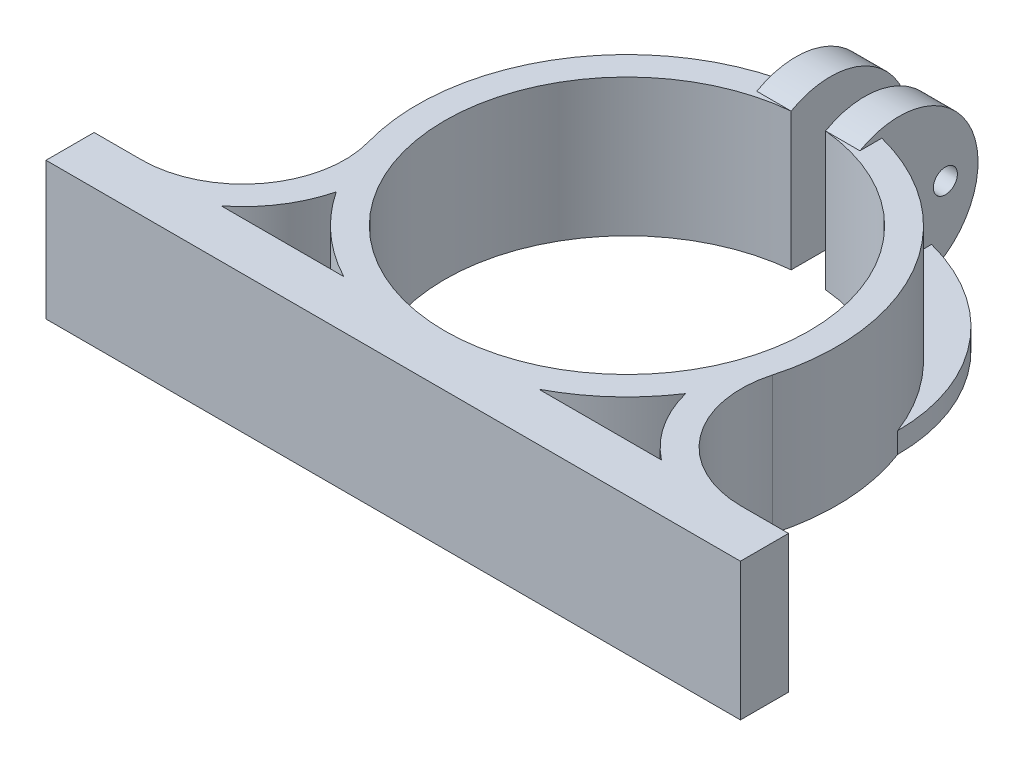
ISO-10303-21;
HEADER;
FILE_DESCRIPTION(('STEP AP214'),'2;1');
FILE_NAME('part.step','',(''),(''),'','','');
FILE_SCHEMA(('AUTOMOTIVE_DESIGN { 1 0 10303 214 1 1 1 1 }'));
ENDSEC;
DATA;
#1=APPLICATION_CONTEXT('core data for automotive mechanical design processes');
#2=APPLICATION_PROTOCOL_DEFINITION('international standard','automotive_design',2000,#1);
#3=PRODUCT_CONTEXT('',#1,'mechanical');
#4=PRODUCT('Part','Part','',(#3));
#5=PRODUCT_RELATED_PRODUCT_CATEGORY('part','',(#4));
#6=PRODUCT_DEFINITION_FORMATION('','',#4);
#7=PRODUCT_DEFINITION_CONTEXT('part definition',#1,'design');
#8=PRODUCT_DEFINITION('design','',#6,#7);
#9=PRODUCT_DEFINITION_SHAPE('','',#8);
#10=(LENGTH_UNIT() NAMED_UNIT(*) SI_UNIT(.MILLI.,.METRE.));
#11=(NAMED_UNIT(*) PLANE_ANGLE_UNIT() SI_UNIT($,.RADIAN.));
#12=(NAMED_UNIT(*) SI_UNIT($,.STERADIAN.) SOLID_ANGLE_UNIT());
#13=UNCERTAINTY_MEASURE_WITH_UNIT(LENGTH_MEASURE(1.E-05),#10,'distance_accuracy_value','');
#14=(GEOMETRIC_REPRESENTATION_CONTEXT(3) GLOBAL_UNCERTAINTY_ASSIGNED_CONTEXT((#13)) GLOBAL_UNIT_ASSIGNED_CONTEXT((#10,
#11,#12)) REPRESENTATION_CONTEXT('',''));
#15=CARTESIAN_POINT('',(0.,0.,0.));
#16=DIRECTION('',(0.,0.,1.));
#17=DIRECTION('',(1.,0.,0.));
#18=AXIS2_PLACEMENT_3D('',#15,#16,#17);
#19=CARTESIAN_POINT('',(0.,20.,-34.));
#20=DIRECTION('',(0.,-1.,0.));
#21=DIRECTION('',(0.,0.,-1.));
#22=AXIS2_PLACEMENT_3D('',#19,#20,#21);
#23=CYLINDRICAL_SURFACE('',#22,30.5);
#24=DIRECTION('',(0.,-1.,0.));
#25=VECTOR('',#24,1.);
#26=CARTESIAN_POINT('',(28.5,3.,-44.8627804912001));
#27=LINE('',#26,#25);
#28=CARTESIAN_POINT('',(28.5,3.,-44.8627804912001));
#29=VERTEX_POINT('',#28);
#30=CARTESIAN_POINT('',(28.5,0.,-44.8627804912001));
#31=VERTEX_POINT('',#30);
#32=EDGE_CURVE('E217',#29,#31,#27,.T.);
#33=ORIENTED_EDGE('',*,*,#32,.F.);
#34=CARTESIAN_POINT('',(0.,3.,-34.));
#35=DIRECTION('',(0.,-1.,0.));
#36=DIRECTION('',(0.,0.,1.));
#37=AXIS2_PLACEMENT_3D('',#34,#35,#36);
#38=CIRCLE('',#37,30.5);
#39=CARTESIAN_POINT('',(7.5,3.,-63.563490998189));
#40=VERTEX_POINT('',#39);
#41=EDGE_CURVE('E204',#40,#29,#38,.T.);
#42=ORIENTED_EDGE('',*,*,#41,.F.);
#43=DIRECTION('',(0.,-1.,0.));
#44=VECTOR('',#43,1.);
#45=CARTESIAN_POINT('',(7.5,20.,-63.563490998189));
#46=LINE('',#45,#44);
#47=CARTESIAN_POINT('',(7.5,20.,-63.563490998189));
#48=VERTEX_POINT('',#47);
#49=EDGE_CURVE('E41',#48,#40,#46,.T.);
#50=ORIENTED_EDGE('',*,*,#49,.F.);
#51=CARTESIAN_POINT('',(0.,20.,-34.));
#52=DIRECTION('',(0.,1.,0.));
#53=DIRECTION('',(0.,0.,1.));
#54=AXIS2_PLACEMENT_3D('',#51,#52,#53);
#55=CIRCLE('',#54,30.5);
#56=CARTESIAN_POINT('',(29.3683181588605,20.,-25.7688464648055));
#57=VERTEX_POINT('',#56);
#58=EDGE_CURVE('E414',#57,#48,#55,.T.);
#59=ORIENTED_EDGE('',*,*,#58,.F.);
#60=DIRECTION('',(0.,-1.,0.));
#61=VECTOR('',#60,1.);
#62=CARTESIAN_POINT('',(29.3683181588605,20.,-25.7688464648055));
#63=LINE('',#62,#61);
#64=CARTESIAN_POINT('',(29.3683181588605,0.,-25.7688464648055));
#65=VERTEX_POINT('',#64);
#66=EDGE_CURVE('E400',#57,#65,#63,.T.);
#67=ORIENTED_EDGE('',*,*,#66,.T.);
#68=CARTESIAN_POINT('',(0.,0.,-34.));
#69=DIRECTION('',(0.,1.,0.));
#70=DIRECTION('',(0.,0.,1.));
#71=AXIS2_PLACEMENT_3D('',#68,#69,#70);
#72=CIRCLE('',#71,30.5);
#73=EDGE_CURVE('E368',#65,#31,#72,.T.);
#74=ORIENTED_EDGE('',*,*,#73,.T.);
#75=EDGE_LOOP('',(#33,#42,#50,#59,#67,#74));
#76=FACE_BOUND('',#75,.T.);
#77=ADVANCED_FACE('F33',(#76),#23,.T.);
#78=CARTESIAN_POINT('',(7.5,10.,-66.0607202623461));
#79=DIRECTION('',(-1.,0.,0.));
#80=DIRECTION('',(0.,0.,1.));
#81=AXIS2_PLACEMENT_3D('',#78,#79,#80);
#82=PLANE('',#81);
#83=CARTESIAN_POINT('',(7.5,10.,-72.8107202623461));
#84=DIRECTION('',(-1.,0.,0.));
#85=DIRECTION('',(0.,0.,1.));
#86=AXIS2_PLACEMENT_3D('',#83,#84,#85);
#87=CIRCLE('',#86,1.75);
#88=CARTESIAN_POINT('',(7.5,10.,-71.0607202623461));
#89=VERTEX_POINT('',#88);
#90=EDGE_CURVE('E484',#89,#89,#87,.T.);
#91=ORIENTED_EDGE('',*,*,#90,.T.);
#92=EDGE_LOOP('',(#91));
#93=FACE_BOUND('',#92,.T.);
#94=DIRECTION('',(0.,-1.,0.));
#95=VECTOR('',#94,1.);
#96=CARTESIAN_POINT('',(7.5,3.,-70.7922943728291));
#97=LINE('',#96,#95);
#98=CARTESIAN_POINT('',(7.5,3.,-70.7922943728291));
#99=VERTEX_POINT('',#98);
#100=CARTESIAN_POINT('',(7.5,0.,-70.7922943728291));
#101=VERTEX_POINT('',#100);
#102=EDGE_CURVE('E210',#99,#101,#97,.T.);
#103=ORIENTED_EDGE('',*,*,#102,.T.);
#104=DIRECTION('',(0.,0.,1.));
#105=VECTOR('',#104,1.);
#106=CARTESIAN_POINT('',(7.5,0.,-60.3818119165458));
#107=LINE('',#106,#105);
#108=CARTESIAN_POINT('',(7.5,0.,-71.7396286081464));
#109=VERTEX_POINT('',#108);
#110=EDGE_CURVE('E493',#109,#101,#107,.T.);
#111=ORIENTED_EDGE('',*,*,#110,.F.);
#112=CARTESIAN_POINT('',(7.5,10.,-66.0607202623461));
#113=DIRECTION('',(-1.,0.,0.));
#114=DIRECTION('',(0.,0.,1.));
#115=AXIS2_PLACEMENT_3D('',#112,#113,#114);
#116=CIRCLE('',#115,11.5);
#117=CARTESIAN_POINT('',(7.5,20.,-60.3818119165458));
#118=VERTEX_POINT('',#117);
#119=EDGE_CURVE('E490',#118,#109,#116,.T.);
#120=ORIENTED_EDGE('',*,*,#119,.F.);
#121=DIRECTION('',(0.,0.,-1.));
#122=VECTOR('',#121,1.);
#123=CARTESIAN_POINT('',(7.5,20.,-21.7800869565217));
#124=LINE('',#123,#122);
#125=EDGE_CURVE('E501',#118,#48,#124,.T.);
#126=ORIENTED_EDGE('',*,*,#125,.T.);
#127=ORIENTED_EDGE('',*,*,#49,.T.);
#128=DIRECTION('',(0.,0.,1.));
#129=VECTOR('',#128,1.);
#130=CARTESIAN_POINT('',(7.5,3.,-70.7922943728291));
#131=LINE('',#130,#129);
#132=EDGE_CURVE('E202',#99,#40,#131,.T.);
#133=ORIENTED_EDGE('',*,*,#132,.F.);
#134=EDGE_LOOP('',(#103,#111,#120,#126,#127,#133));
#135=FACE_BOUND('',#134,.T.);
#136=ADVANCED_FACE('F220',(#93,#135),#82,.F.);
#137=CARTESIAN_POINT('',(0.,20.,-34.));
#138=DIRECTION('',(0.,-1.,0.));
#139=DIRECTION('',(0.,0.,-1.));
#140=AXIS2_PLACEMENT_3D('',#137,#138,#139);
#141=CYLINDRICAL_SURFACE('',#140,30.5);
#142=DIRECTION('',(0.,-1.,0.));
#143=VECTOR('',#142,1.);
#144=CARTESIAN_POINT('',(-28.5,3.,-44.8627804912001));
#145=LINE('',#144,#143);
#146=CARTESIAN_POINT('',(-28.5,3.,-44.8627804912001));
#147=VERTEX_POINT('',#146);
#148=CARTESIAN_POINT('',(-28.5,0.,-44.8627804912001));
#149=VERTEX_POINT('',#148);
#150=EDGE_CURVE('E52',#147,#149,#145,.T.);
#151=ORIENTED_EDGE('',*,*,#150,.T.);
#152=CARTESIAN_POINT('',(0.,0.,-34.));
#153=DIRECTION('',(0.,1.,0.));
#154=DIRECTION('',(0.,0.,1.));
#155=AXIS2_PLACEMENT_3D('',#152,#153,#154);
#156=CIRCLE('',#155,30.5);
#157=CARTESIAN_POINT('',(-29.3683181588605,0.,-25.7688464648056));
#158=VERTEX_POINT('',#157);
#159=EDGE_CURVE('E377',#149,#158,#156,.T.);
#160=ORIENTED_EDGE('',*,*,#159,.T.);
#161=DIRECTION('',(0.,-1.,0.));
#162=VECTOR('',#161,1.);
#163=CARTESIAN_POINT('',(-29.3683181588605,20.,-25.7688464648056));
#164=LINE('',#163,#162);
#165=CARTESIAN_POINT('',(-29.3683181588605,20.,-25.7688464648056));
#166=VERTEX_POINT('',#165);
#167=EDGE_CURVE('E391',#166,#158,#164,.T.);
#168=ORIENTED_EDGE('',*,*,#167,.F.);
#169=CARTESIAN_POINT('',(0.,20.,-34.));
#170=DIRECTION('',(0.,1.,0.));
#171=DIRECTION('',(0.,0.,1.));
#172=AXIS2_PLACEMENT_3D('',#169,#170,#171);
#173=CIRCLE('',#172,30.5);
#174=CARTESIAN_POINT('',(-7.5,20.,-63.563490998189));
#175=VERTEX_POINT('',#174);
#176=EDGE_CURVE('E425',#175,#166,#173,.T.);
#177=ORIENTED_EDGE('',*,*,#176,.F.);
#178=DIRECTION('',(0.,-1.,0.));
#179=VECTOR('',#178,1.);
#180=CARTESIAN_POINT('',(-7.5,20.,-63.563490998189));
#181=LINE('',#180,#179);
#182=CARTESIAN_POINT('',(-7.5,3.,-63.563490998189));
#183=VERTEX_POINT('',#182);
#184=EDGE_CURVE('E11',#175,#183,#181,.T.);
#185=ORIENTED_EDGE('',*,*,#184,.T.);
#186=CARTESIAN_POINT('',(0.,3.,-34.));
#187=DIRECTION('',(0.,-1.,0.));
#188=DIRECTION('',(0.,0.,1.));
#189=AXIS2_PLACEMENT_3D('',#186,#187,#188);
#190=CIRCLE('',#189,30.5);
#191=EDGE_CURVE('E47',#147,#183,#190,.T.);
#192=ORIENTED_EDGE('',*,*,#191,.F.);
#193=EDGE_LOOP('',(#151,#160,#168,#177,#185,#192));
#194=FACE_BOUND('',#193,.T.);
#195=ADVANCED_FACE('F249',(#194),#141,.T.);
#196=CARTESIAN_POINT('',(-7.5,10.,-66.0607202623461));
#197=DIRECTION('',(-1.,0.,0.));
#198=DIRECTION('',(0.,0.,1.));
#199=AXIS2_PLACEMENT_3D('',#196,#197,#198);
#200=PLANE('',#199);
#201=CARTESIAN_POINT('',(-7.5,10.,-72.8107202623461));
#202=DIRECTION('',(-1.,0.,0.));
#203=DIRECTION('',(0.,0.,1.));
#204=AXIS2_PLACEMENT_3D('',#201,#202,#203);
#205=CIRCLE('',#204,1.75);
#206=CARTESIAN_POINT('',(-7.5,10.,-71.0607202623461));
#207=VERTEX_POINT('',#206);
#208=EDGE_CURVE('E461',#207,#207,#205,.T.);
#209=ORIENTED_EDGE('',*,*,#208,.F.);
#210=EDGE_LOOP('',(#209));
#211=FACE_BOUND('',#210,.T.);
#212=DIRECTION('',(0.,0.,1.));
#213=VECTOR('',#212,1.);
#214=CARTESIAN_POINT('',(-7.5,0.,-60.3818119165458));
#215=LINE('',#214,#213);
#216=CARTESIAN_POINT('',(-7.5,0.,-71.7396286081464));
#217=VERTEX_POINT('',#216);
#218=CARTESIAN_POINT('',(-7.5,0.,-70.7922943728291));
#219=VERTEX_POINT('',#218);
#220=EDGE_CURVE('E472',#217,#219,#215,.T.);
#221=ORIENTED_EDGE('',*,*,#220,.T.);
#222=DIRECTION('',(0.,-1.,0.));
#223=VECTOR('',#222,1.);
#224=CARTESIAN_POINT('',(-7.5,3.,-70.7922943728291));
#225=LINE('',#224,#223);
#226=CARTESIAN_POINT('',(-7.5,3.,-70.7922943728291));
#227=VERTEX_POINT('',#226);
#228=EDGE_CURVE('E455',#227,#219,#225,.T.);
#229=ORIENTED_EDGE('',*,*,#228,.F.);
#230=DIRECTION('',(0.,0.,-1.));
#231=VECTOR('',#230,1.);
#232=CARTESIAN_POINT('',(-7.5,3.,-70.7922943728291));
#233=LINE('',#232,#231);
#234=EDGE_CURVE('E458',#183,#227,#233,.T.);
#235=ORIENTED_EDGE('',*,*,#234,.F.);
#236=ORIENTED_EDGE('',*,*,#184,.F.);
#237=DIRECTION('',(0.,0.,-1.));
#238=VECTOR('',#237,1.);
#239=CARTESIAN_POINT('',(-7.5,20.,-21.7800869565217));
#240=LINE('',#239,#238);
#241=CARTESIAN_POINT('',(-7.5,20.,-60.3818119165458));
#242=VERTEX_POINT('',#241);
#243=EDGE_CURVE('E479',#242,#175,#240,.T.);
#244=ORIENTED_EDGE('',*,*,#243,.F.);
#245=CARTESIAN_POINT('',(-7.5,10.,-66.0607202623461));
#246=DIRECTION('',(-1.,0.,0.));
#247=DIRECTION('',(0.,0.,1.));
#248=AXIS2_PLACEMENT_3D('',#245,#246,#247);
#249=CIRCLE('',#248,11.5);
#250=EDGE_CURVE('E465',#242,#217,#249,.T.);
#251=ORIENTED_EDGE('',*,*,#250,.T.);
#252=EDGE_LOOP('',(#221,#229,#235,#236,#244,#251));
#253=FACE_BOUND('',#252,.T.);
#254=ADVANCED_FACE('F245',(#211,#253),#200,.T.);
#255=CARTESIAN_POINT('',(-43.6,20.,-21.7800869565217));
#256=DIRECTION('',(0.,-1.,0.));
#257=DIRECTION('',(0.,0.,-1.));
#258=AXIS2_PLACEMENT_3D('',#255,#256,#257);
#259=PLANE('',#258);
#260=CARTESIAN_POINT('',(0.,20.,-34.));
#261=DIRECTION('',(0.,-1.,0.));
#262=DIRECTION('',(0.,0.,1.));
#263=AXIS2_PLACEMENT_3D('',#260,#261,#262);
#264=CIRCLE('',#263,30.5);
#265=CARTESIAN_POINT('',(-14.1862609591111,20.,-7.));
#266=VERTEX_POINT('',#265);
#267=CARTESIAN_POINT('',(-25.4061030572735,20.,-17.1245762292262));
#268=VERTEX_POINT('',#267);
#269=EDGE_CURVE('E530',#266,#268,#264,.T.);
#270=ORIENTED_EDGE('',*,*,#269,.F.);
#271=DIRECTION('',(1.,0.,0.));
#272=VECTOR('',#271,1.);
#273=CARTESIAN_POINT('',(-32.0137712929455,20.,-7.));
#274=LINE('',#273,#272);
#275=CARTESIAN_POINT('',(-32.0137712929455,20.,-7.));
#276=VERTEX_POINT('',#275);
#277=EDGE_CURVE('E536',#276,#266,#274,.T.);
#278=ORIENTED_EDGE('',*,*,#277,.F.);
#279=CARTESIAN_POINT('',(-43.6,20.,-21.7800869565217));
#280=DIRECTION('',(0.,-1.,0.));
#281=DIRECTION('',(0.,0.,-1.));
#282=AXIS2_PLACEMENT_3D('',#279,#280,#281);
#283=CIRCLE('',#282,18.7800869565217);
#284=EDGE_CURVE('E532',#268,#276,#283,.T.);
#285=ORIENTED_EDGE('',*,*,#284,.F.);
#286=EDGE_LOOP('',(#270,#278,#285));
#287=FACE_BOUND('',#286,.T.);
#288=CARTESIAN_POINT('',(0.,20.,-34.));
#289=DIRECTION('',(0.,-1.,0.));
#290=DIRECTION('',(0.,0.,1.));
#291=AXIS2_PLACEMENT_3D('',#288,#289,#290);
#292=CIRCLE('',#291,26.5);
#293=CARTESIAN_POINT('',(2.5,20.,-60.3818119165458));
#294=VERTEX_POINT('',#293);
#295=CARTESIAN_POINT('',(-2.5,20.,-60.3818119165458));
#296=VERTEX_POINT('',#295);
#297=EDGE_CURVE('E422',#294,#296,#292,.T.);
#298=ORIENTED_EDGE('',*,*,#297,.T.);
#299=DIRECTION('',(-1.,0.,0.));
#300=VECTOR('',#299,1.);
#301=CARTESIAN_POINT('',(-2.5,20.,-60.3818119165458));
#302=LINE('',#301,#300);
#303=EDGE_CURVE('E476',#296,#242,#302,.T.);
#304=ORIENTED_EDGE('',*,*,#303,.T.);
#305=ORIENTED_EDGE('',*,*,#243,.T.);
#306=ORIENTED_EDGE('',*,*,#176,.T.);
#307=CARTESIAN_POINT('',(-43.6,20.,-21.7800869565217));
#308=DIRECTION('',(0.,-1.,0.));
#309=DIRECTION('',(0.,0.,-1.));
#310=AXIS2_PLACEMENT_3D('',#307,#308,#309);
#311=CIRCLE('',#310,14.7800869565217);
#312=CARTESIAN_POINT('',(-43.6,20.,-7.));
#313=VERTEX_POINT('',#312);
#314=EDGE_CURVE('E427',#166,#313,#311,.T.);
#315=ORIENTED_EDGE('',*,*,#314,.T.);
#316=DIRECTION('',(-1.,0.,0.));
#317=VECTOR('',#316,1.);
#318=CARTESIAN_POINT('',(-50.5,20.,-7.));
#319=LINE('',#318,#317);
#320=CARTESIAN_POINT('',(-50.5,20.,-7.));
#321=VERTEX_POINT('',#320);
#322=EDGE_CURVE('E388',#313,#321,#319,.T.);
#323=ORIENTED_EDGE('',*,*,#322,.T.);
#324=DIRECTION('',(0.,0.,1.));
#325=VECTOR('',#324,1.);
#326=CARTESIAN_POINT('',(-50.5,20.,0.));
#327=LINE('',#326,#325);
#328=CARTESIAN_POINT('',(-50.5,20.,0.));
#329=VERTEX_POINT('',#328);
#330=EDGE_CURVE('E383',#321,#329,#327,.T.);
#331=ORIENTED_EDGE('',*,*,#330,.T.);
#332=DIRECTION('',(1.,0.,0.));
#333=VECTOR('',#332,1.);
#334=CARTESIAN_POINT('',(-50.5,20.,0.));
#335=LINE('',#334,#333);
#336=CARTESIAN_POINT('',(50.5,20.,0.));
#337=VERTEX_POINT('',#336);
#338=EDGE_CURVE('E416',#329,#337,#335,.T.);
#339=ORIENTED_EDGE('',*,*,#338,.T.);
#340=DIRECTION('',(0.,0.,-1.));
#341=VECTOR('',#340,1.);
#342=CARTESIAN_POINT('',(50.5,20.,0.));
#343=LINE('',#342,#341);
#344=CARTESIAN_POINT('',(50.5,20.,-7.));
#345=VERTEX_POINT('',#344);
#346=EDGE_CURVE('E355',#337,#345,#343,.T.);
#347=ORIENTED_EDGE('',*,*,#346,.T.);
#348=DIRECTION('',(-1.,0.,0.));
#349=VECTOR('',#348,1.);
#350=CARTESIAN_POINT('',(43.6,20.,-7.));
#351=LINE('',#350,#349);
#352=CARTESIAN_POINT('',(43.6,20.,-7.));
#353=VERTEX_POINT('',#352);
#354=EDGE_CURVE('E409',#345,#353,#351,.T.);
#355=ORIENTED_EDGE('',*,*,#354,.T.);
#356=CARTESIAN_POINT('',(43.6,20.,-21.7800869565217));
#357=DIRECTION('',(0.,-1.,0.));
#358=DIRECTION('',(0.,0.,1.));
#359=AXIS2_PLACEMENT_3D('',#356,#357,#358);
#360=CIRCLE('',#359,14.7800869565217);
#361=EDGE_CURVE('E412',#353,#57,#360,.T.);
#362=ORIENTED_EDGE('',*,*,#361,.T.);
#363=ORIENTED_EDGE('',*,*,#58,.T.);
#364=ORIENTED_EDGE('',*,*,#125,.F.);
#365=DIRECTION('',(-1.,0.,0.));
#366=VECTOR('',#365,1.);
#367=CARTESIAN_POINT('',(7.5,20.,-60.3818119165458));
#368=LINE('',#367,#366);
#369=EDGE_CURVE('E498',#118,#294,#368,.T.);
#370=ORIENTED_EDGE('',*,*,#369,.T.);
#371=EDGE_LOOP('',(#298,#304,#305,#306,#315,#323,#331,#339,#347,#355,#362,#363,#364,#370));
#372=FACE_BOUND('',#371,.T.);
#373=CARTESIAN_POINT('',(0.,20.,-34.));
#374=DIRECTION('',(0.,-1.,0.));
#375=DIRECTION('',(0.,0.,1.));
#376=AXIS2_PLACEMENT_3D('',#373,#374,#375);
#377=CIRCLE('',#376,30.5);
#378=CARTESIAN_POINT('',(25.4061030572735,20.,-17.1245762292262));
#379=VERTEX_POINT('',#378);
#380=CARTESIAN_POINT('',(14.1862609591111,20.,-7.));
#381=VERTEX_POINT('',#380);
#382=EDGE_CURVE('E506',#379,#381,#377,.T.);
#383=ORIENTED_EDGE('',*,*,#382,.F.);
#384=CARTESIAN_POINT('',(43.6,20.,-21.7800869565217));
#385=DIRECTION('',(0.,-1.,0.));
#386=DIRECTION('',(0.,0.,1.));
#387=AXIS2_PLACEMENT_3D('',#384,#385,#386);
#388=CIRCLE('',#387,18.7800869565217);
#389=CARTESIAN_POINT('',(32.0137712929455,20.,-7.));
#390=VERTEX_POINT('',#389);
#391=EDGE_CURVE('E512',#390,#379,#388,.T.);
#392=ORIENTED_EDGE('',*,*,#391,.F.);
#393=DIRECTION('',(1.,0.,0.));
#394=VECTOR('',#393,1.);
#395=CARTESIAN_POINT('',(14.1862609591111,20.,-7.));
#396=LINE('',#395,#394);
#397=EDGE_CURVE('E508',#381,#390,#396,.T.);
#398=ORIENTED_EDGE('',*,*,#397,.F.);
#399=EDGE_LOOP('',(#383,#392,#398));
#400=FACE_BOUND('',#399,.T.);
#401=ADVANCED_FACE('F248',(#287,#372,#400),#259,.F.);
#402=CARTESIAN_POINT('',(-43.6,0.,-21.7800869565217));
#403=DIRECTION('',(0.,-1.,0.));
#404=DIRECTION('',(0.,0.,-1.));
#405=AXIS2_PLACEMENT_3D('',#402,#403,#404);
#406=PLANE('',#405);
#407=CARTESIAN_POINT('',(0.,0.,-44.8627804912002));
#408=DIRECTION('',(0.,1.,0.));
#409=DIRECTION('',(-1.,0.,0.));
#410=AXIS2_PLACEMENT_3D('',#407,#408,#409);
#411=ELLIPSE('',#410,28.5,26.8768481169462);
#412=EDGE_CURVE('E207',#31,#101,#411,.T.);
#413=ORIENTED_EDGE('',*,*,#412,.F.);
#414=ORIENTED_EDGE('',*,*,#73,.F.);
#415=CARTESIAN_POINT('',(43.6,0.,-21.7800869565217));
#416=DIRECTION('',(0.,-1.,0.));
#417=DIRECTION('',(0.,0.,1.));
#418=AXIS2_PLACEMENT_3D('',#415,#416,#417);
#419=CIRCLE('',#418,14.7800869565217);
#420=CARTESIAN_POINT('',(43.6,0.,-7.));
#421=VERTEX_POINT('',#420);
#422=EDGE_CURVE('E363',#421,#65,#419,.T.);
#423=ORIENTED_EDGE('',*,*,#422,.F.);
#424=DIRECTION('',(-1.,0.,0.));
#425=VECTOR('',#424,1.);
#426=CARTESIAN_POINT('',(43.6,0.,-7.));
#427=LINE('',#426,#425);
#428=CARTESIAN_POINT('',(50.5,0.,-7.));
#429=VERTEX_POINT('',#428);
#430=EDGE_CURVE('E361',#429,#421,#427,.T.);
#431=ORIENTED_EDGE('',*,*,#430,.F.);
#432=DIRECTION('',(0.,0.,-1.));
#433=VECTOR('',#432,1.);
#434=CARTESIAN_POINT('',(50.5,0.,0.));
#435=LINE('',#434,#433);
#436=CARTESIAN_POINT('',(50.5,0.,0.));
#437=VERTEX_POINT('',#436);
#438=EDGE_CURVE('E350',#437,#429,#435,.T.);
#439=ORIENTED_EDGE('',*,*,#438,.F.);
#440=DIRECTION('',(1.,0.,0.));
#441=VECTOR('',#440,1.);
#442=CARTESIAN_POINT('',(-50.5,0.,0.));
#443=LINE('',#442,#441);
#444=CARTESIAN_POINT('',(-50.5,0.,0.));
#445=VERTEX_POINT('',#444);
#446=EDGE_CURVE('E341',#445,#437,#443,.T.);
#447=ORIENTED_EDGE('',*,*,#446,.F.);
#448=DIRECTION('',(0.,0.,1.));
#449=VECTOR('',#448,1.);
#450=CARTESIAN_POINT('',(-50.5,0.,0.));
#451=LINE('',#450,#449);
#452=CARTESIAN_POINT('',(-50.5,0.,-7.));
#453=VERTEX_POINT('',#452);
#454=EDGE_CURVE('E351',#453,#445,#451,.T.);
#455=ORIENTED_EDGE('',*,*,#454,.F.);
#456=DIRECTION('',(-1.,0.,0.));
#457=VECTOR('',#456,1.);
#458=CARTESIAN_POINT('',(-50.5,0.,-7.));
#459=LINE('',#458,#457);
#460=CARTESIAN_POINT('',(-43.6,0.,-7.));
#461=VERTEX_POINT('',#460);
#462=EDGE_CURVE('E381',#461,#453,#459,.T.);
#463=ORIENTED_EDGE('',*,*,#462,.F.);
#464=CARTESIAN_POINT('',(-43.6,0.,-21.7800869565217));
#465=DIRECTION('',(0.,-1.,0.));
#466=DIRECTION('',(0.,0.,-1.));
#467=AXIS2_PLACEMENT_3D('',#464,#465,#466);
#468=CIRCLE('',#467,14.7800869565217);
#469=EDGE_CURVE('E379',#158,#461,#468,.T.);
#470=ORIENTED_EDGE('',*,*,#469,.F.);
#471=ORIENTED_EDGE('',*,*,#159,.F.);
#472=CARTESIAN_POINT('',(0.,0.,-44.8627804912002));
#473=DIRECTION('',(0.,1.,0.));
#474=DIRECTION('',(-1.,0.,0.));
#475=AXIS2_PLACEMENT_3D('',#472,#473,#474);
#476=ELLIPSE('',#475,28.5,26.8768481169462);
#477=EDGE_CURVE('E216',#219,#149,#476,.T.);
#478=ORIENTED_EDGE('',*,*,#477,.F.);
#479=ORIENTED_EDGE('',*,*,#220,.F.);
#480=DIRECTION('',(-1.,0.,0.));
#481=VECTOR('',#480,1.);
#482=CARTESIAN_POINT('',(-2.5,0.,-71.7396286081464));
#483=LINE('',#482,#481);
#484=CARTESIAN_POINT('',(-2.5,0.,-71.7396286081464));
#485=VERTEX_POINT('',#484);
#486=EDGE_CURVE('E471',#485,#217,#483,.T.);
#487=ORIENTED_EDGE('',*,*,#486,.F.);
#488=DIRECTION('',(0.,0.,-1.));
#489=VECTOR('',#488,1.);
#490=CARTESIAN_POINT('',(-2.5,0.,-60.3818119165458));
#491=LINE('',#490,#489);
#492=CARTESIAN_POINT('',(-2.49999999999999,0.,-60.3818119165458));
#493=VERTEX_POINT('',#492);
#494=EDGE_CURVE('E375',#493,#485,#491,.T.);
#495=ORIENTED_EDGE('',*,*,#494,.F.);
#496=CARTESIAN_POINT('',(0.,0.,-34.));
#497=DIRECTION('',(0.,-1.,0.));
#498=DIRECTION('',(0.,0.,1.));
#499=AXIS2_PLACEMENT_3D('',#496,#497,#498);
#500=CIRCLE('',#499,26.5);
#501=CARTESIAN_POINT('',(2.5,0.,-60.3818119165458));
#502=VERTEX_POINT('',#501);
#503=EDGE_CURVE('E373',#502,#493,#500,.T.);
#504=ORIENTED_EDGE('',*,*,#503,.F.);
#505=DIRECTION('',(0.,0.,1.));
#506=VECTOR('',#505,1.);
#507=CARTESIAN_POINT('',(2.5,0.,-60.3818119165458));
#508=LINE('',#507,#506);
#509=CARTESIAN_POINT('',(2.5,0.,-71.7396286081464));
#510=VERTEX_POINT('',#509);
#511=EDGE_CURVE('E371',#510,#502,#508,.T.);
#512=ORIENTED_EDGE('',*,*,#511,.F.);
#513=DIRECTION('',(-1.,0.,0.));
#514=VECTOR('',#513,1.);
#515=CARTESIAN_POINT('',(7.5,0.,-71.7396286081464));
#516=LINE('',#515,#514);
#517=EDGE_CURVE('E495',#109,#510,#516,.T.);
#518=ORIENTED_EDGE('',*,*,#517,.F.);
#519=ORIENTED_EDGE('',*,*,#110,.T.);
#520=EDGE_LOOP('',(#413,#414,#423,#431,#439,#447,#455,#463,#470,#471,#478,#479,#487,#495,#504,
#512,#518,#519));
#521=FACE_BOUND('',#520,.T.);
#522=DIRECTION('',(1.,0.,0.));
#523=VECTOR('',#522,1.);
#524=CARTESIAN_POINT('',(-32.0137712929455,0.,-7.));
#525=LINE('',#524,#523);
#526=CARTESIAN_POINT('',(-32.0137712929455,0.,-7.));
#527=VERTEX_POINT('',#526);
#528=CARTESIAN_POINT('',(-14.1862609591111,0.,-7.));
#529=VERTEX_POINT('',#528);
#530=EDGE_CURVE('E533',#527,#529,#525,.T.);
#531=ORIENTED_EDGE('',*,*,#530,.T.);
#532=CARTESIAN_POINT('',(0.,0.,-34.));
#533=DIRECTION('',(0.,-1.,0.));
#534=DIRECTION('',(0.,0.,1.));
#535=AXIS2_PLACEMENT_3D('',#532,#533,#534);
#536=CIRCLE('',#535,30.5);
#537=CARTESIAN_POINT('',(-25.4061030572735,0.,-17.1245762292262));
#538=VERTEX_POINT('',#537);
#539=EDGE_CURVE('E529',#529,#538,#536,.T.);
#540=ORIENTED_EDGE('',*,*,#539,.T.);
#541=CARTESIAN_POINT('',(-43.6,0.,-21.7800869565217));
#542=DIRECTION('',(0.,-1.,0.));
#543=DIRECTION('',(0.,0.,-1.));
#544=AXIS2_PLACEMENT_3D('',#541,#542,#543);
#545=CIRCLE('',#544,18.7800869565217);
#546=EDGE_CURVE('E539',#538,#527,#545,.T.);
#547=ORIENTED_EDGE('',*,*,#546,.T.);
#548=EDGE_LOOP('',(#531,#540,#547));
#549=FACE_BOUND('',#548,.T.);
#550=CARTESIAN_POINT('',(43.6,0.,-21.7800869565217));
#551=DIRECTION('',(0.,-1.,0.));
#552=DIRECTION('',(0.,0.,1.));
#553=AXIS2_PLACEMENT_3D('',#550,#551,#552);
#554=CIRCLE('',#553,18.7800869565217);
#555=CARTESIAN_POINT('',(32.0137712929455,0.,-7.));
#556=VERTEX_POINT('',#555);
#557=CARTESIAN_POINT('',(25.4061030572735,0.,-17.1245762292262));
#558=VERTEX_POINT('',#557);
#559=EDGE_CURVE('E509',#556,#558,#554,.T.);
#560=ORIENTED_EDGE('',*,*,#559,.T.);
#561=CARTESIAN_POINT('',(0.,0.,-34.));
#562=DIRECTION('',(0.,-1.,0.));
#563=DIRECTION('',(0.,0.,1.));
#564=AXIS2_PLACEMENT_3D('',#561,#562,#563);
#565=CIRCLE('',#564,30.5);
#566=CARTESIAN_POINT('',(14.1862609591111,0.,-7.));
#567=VERTEX_POINT('',#566);
#568=EDGE_CURVE('E505',#558,#567,#565,.T.);
#569=ORIENTED_EDGE('',*,*,#568,.T.);
#570=DIRECTION('',(1.,0.,0.));
#571=VECTOR('',#570,1.);
#572=CARTESIAN_POINT('',(14.1862609591111,0.,-7.));
#573=LINE('',#572,#571);
#574=EDGE_CURVE('E517',#567,#556,#573,.T.);
#575=ORIENTED_EDGE('',*,*,#574,.T.);
#576=EDGE_LOOP('',(#560,#569,#575));
#577=FACE_BOUND('',#576,.T.);
#578=ADVANCED_FACE('F292',(#521,#549,#577),#406,.T.);
#579=CARTESIAN_POINT('',(-50.5,20.,0.));
#580=DIRECTION('',(1.,0.,0.));
#581=DIRECTION('',(0.,0.,-1.));
#582=AXIS2_PLACEMENT_3D('',#579,#580,#581);
#583=PLANE('',#582);
#584=ORIENTED_EDGE('',*,*,#454,.T.);
#585=DIRECTION('',(0.,-1.,0.));
#586=VECTOR('',#585,1.);
#587=CARTESIAN_POINT('',(-50.5,20.,0.));
#588=LINE('',#587,#586);
#589=EDGE_CURVE('E346',#329,#445,#588,.T.);
#590=ORIENTED_EDGE('',*,*,#589,.F.);
#591=ORIENTED_EDGE('',*,*,#330,.F.);
#592=DIRECTION('',(0.,-1.,0.));
#593=VECTOR('',#592,1.);
#594=CARTESIAN_POINT('',(-50.5,20.,-7.));
#595=LINE('',#594,#593);
#596=EDGE_CURVE('E384',#321,#453,#595,.T.);
#597=ORIENTED_EDGE('',*,*,#596,.T.);
#598=EDGE_LOOP('',(#584,#590,#591,#597));
#599=FACE_BOUND('',#598,.T.);
#600=ADVANCED_FACE('F35',(#599),#583,.F.);
#601=CARTESIAN_POINT('',(-50.5,20.,0.));
#602=DIRECTION('',(0.,0.,-1.));
#603=DIRECTION('',(-1.,0.,0.));
#604=AXIS2_PLACEMENT_3D('',#601,#602,#603);
#605=PLANE('',#604);
#606=ORIENTED_EDGE('',*,*,#446,.T.);
#607=DIRECTION('',(0.,-1.,0.));
#608=VECTOR('',#607,1.);
#609=CARTESIAN_POINT('',(50.5,20.,0.));
#610=LINE('',#609,#608);
#611=EDGE_CURVE('E343',#337,#437,#610,.T.);
#612=ORIENTED_EDGE('',*,*,#611,.F.);
#613=ORIENTED_EDGE('',*,*,#338,.F.);
#614=ORIENTED_EDGE('',*,*,#589,.T.);
#615=EDGE_LOOP('',(#606,#612,#613,#614));
#616=FACE_BOUND('',#615,.T.);
#617=ADVANCED_FACE('F331',(#616),#605,.F.);
#618=CARTESIAN_POINT('',(50.5,20.,0.));
#619=DIRECTION('',(-1.,0.,0.));
#620=DIRECTION('',(0.,0.,1.));
#621=AXIS2_PLACEMENT_3D('',#618,#619,#620);
#622=PLANE('',#621);
#623=ORIENTED_EDGE('',*,*,#438,.T.);
#624=DIRECTION('',(0.,-1.,0.));
#625=VECTOR('',#624,1.);
#626=CARTESIAN_POINT('',(50.5,20.,-7.));
#627=LINE('',#626,#625);
#628=EDGE_CURVE('E356',#345,#429,#627,.T.);
#629=ORIENTED_EDGE('',*,*,#628,.F.);
#630=ORIENTED_EDGE('',*,*,#346,.F.);
#631=ORIENTED_EDGE('',*,*,#611,.T.);
#632=EDGE_LOOP('',(#623,#629,#630,#631));
#633=FACE_BOUND('',#632,.T.);
#634=ADVANCED_FACE('F328',(#633),#622,.F.);
#635=CARTESIAN_POINT('',(43.6,20.,-7.));
#636=DIRECTION('',(0.,0.,1.));
#637=DIRECTION('',(1.,0.,0.));
#638=AXIS2_PLACEMENT_3D('',#635,#636,#637);
#639=PLANE('',#638);
#640=ORIENTED_EDGE('',*,*,#430,.T.);
#641=DIRECTION('',(0.,-1.,0.));
#642=VECTOR('',#641,1.);
#643=CARTESIAN_POINT('',(43.6,20.,-7.));
#644=LINE('',#643,#642);
#645=EDGE_CURVE('E403',#353,#421,#644,.T.);
#646=ORIENTED_EDGE('',*,*,#645,.F.);
#647=ORIENTED_EDGE('',*,*,#354,.F.);
#648=ORIENTED_EDGE('',*,*,#628,.T.);
#649=EDGE_LOOP('',(#640,#646,#647,#648));
#650=FACE_BOUND('',#649,.T.);
#651=ADVANCED_FACE('F324',(#650),#639,.F.);
#652=CARTESIAN_POINT('',(43.6,20.,-21.7800869565217));
#653=DIRECTION('',(0.,-1.,0.));
#654=DIRECTION('',(0.,0.,-1.));
#655=AXIS2_PLACEMENT_3D('',#652,#653,#654);
#656=CYLINDRICAL_SURFACE('',#655,14.7800869565217);
#657=ORIENTED_EDGE('',*,*,#422,.T.);
#658=ORIENTED_EDGE('',*,*,#66,.F.);
#659=ORIENTED_EDGE('',*,*,#361,.F.);
#660=ORIENTED_EDGE('',*,*,#645,.T.);
#661=EDGE_LOOP('',(#657,#658,#659,#660));
#662=FACE_BOUND('',#661,.T.);
#663=ADVANCED_FACE('F317',(#662),#656,.F.);
#664=CARTESIAN_POINT('',(2.5,20.,-60.3818119165458));
#665=DIRECTION('',(1.,0.,0.));
#666=DIRECTION('',(0.,0.,-1.));
#667=AXIS2_PLACEMENT_3D('',#664,#665,#666);
#668=PLANE('',#667);
#669=DIRECTION('',(0.,-1.,0.));
#670=VECTOR('',#669,1.);
#671=CARTESIAN_POINT('',(2.5,20.,-60.3818119165458));
#672=LINE('',#671,#670);
#673=EDGE_CURVE('E397',#294,#502,#672,.T.);
#674=ORIENTED_EDGE('',*,*,#673,.F.);
#675=CARTESIAN_POINT('',(2.5,10.,-66.0607202623461));
#676=DIRECTION('',(-1.,0.,0.));
#677=DIRECTION('',(0.,0.,1.));
#678=AXIS2_PLACEMENT_3D('',#675,#676,#677);
#679=CIRCLE('',#678,11.5);
#680=EDGE_CURVE('E487',#294,#510,#679,.T.);
#681=ORIENTED_EDGE('',*,*,#680,.T.);
#682=ORIENTED_EDGE('',*,*,#511,.T.);
#683=EDGE_LOOP('',(#674,#681,#682));
#684=FACE_BOUND('',#683,.T.);
#685=CARTESIAN_POINT('',(2.5,10.,-72.8107202623461));
#686=DIRECTION('',(-1.,0.,0.));
#687=DIRECTION('',(0.,0.,1.));
#688=AXIS2_PLACEMENT_3D('',#685,#686,#687);
#689=CIRCLE('',#688,1.75);
#690=CARTESIAN_POINT('',(2.5,10.,-71.0607202623461));
#691=VERTEX_POINT('',#690);
#692=EDGE_CURVE('E483',#691,#691,#689,.T.);
#693=ORIENTED_EDGE('',*,*,#692,.F.);
#694=EDGE_LOOP('',(#693));
#695=FACE_BOUND('',#694,.T.);
#696=ADVANCED_FACE('F313',(#684,#695),#668,.F.);
#697=CARTESIAN_POINT('',(0.,20.,-34.));
#698=DIRECTION('',(0.,-1.,0.));
#699=DIRECTION('',(0.,0.,-1.));
#700=AXIS2_PLACEMENT_3D('',#697,#698,#699);
#701=CYLINDRICAL_SURFACE('',#700,26.5);
#702=ORIENTED_EDGE('',*,*,#503,.T.);
#703=DIRECTION('',(0.,-1.,0.));
#704=VECTOR('',#703,1.);
#705=CARTESIAN_POINT('',(-2.49999999999999,20.,-60.3818119165458));
#706=LINE('',#705,#704);
#707=EDGE_CURVE('E394',#296,#493,#706,.T.);
#708=ORIENTED_EDGE('',*,*,#707,.F.);
#709=ORIENTED_EDGE('',*,*,#297,.F.);
#710=ORIENTED_EDGE('',*,*,#673,.T.);
#711=EDGE_LOOP('',(#702,#708,#709,#710));
#712=FACE_BOUND('',#711,.T.);
#713=ADVANCED_FACE('F309',(#712),#701,.F.);
#714=CARTESIAN_POINT('',(-2.5,20.,-60.3818119165458));
#715=DIRECTION('',(-1.,0.,0.));
#716=DIRECTION('',(0.,0.,1.));
#717=AXIS2_PLACEMENT_3D('',#714,#715,#716);
#718=PLANE('',#717);
#719=ORIENTED_EDGE('',*,*,#494,.T.);
#720=CARTESIAN_POINT('',(-2.5,10.,-66.0607202623461));
#721=DIRECTION('',(-1.,0.,0.));
#722=DIRECTION('',(0.,0.,1.));
#723=AXIS2_PLACEMENT_3D('',#720,#721,#722);
#724=CIRCLE('',#723,11.5);
#725=EDGE_CURVE('E468',#296,#485,#724,.T.);
#726=ORIENTED_EDGE('',*,*,#725,.F.);
#727=ORIENTED_EDGE('',*,*,#707,.T.);
#728=EDGE_LOOP('',(#719,#726,#727));
#729=FACE_BOUND('',#728,.T.);
#730=CARTESIAN_POINT('',(-2.5,10.,-72.8107202623461));
#731=DIRECTION('',(-1.,0.,0.));
#732=DIRECTION('',(0.,0.,1.));
#733=AXIS2_PLACEMENT_3D('',#730,#731,#732);
#734=CIRCLE('',#733,1.75);
#735=CARTESIAN_POINT('',(-2.5,10.,-71.0607202623461));
#736=VERTEX_POINT('',#735);
#737=EDGE_CURVE('E462',#736,#736,#734,.T.);
#738=ORIENTED_EDGE('',*,*,#737,.T.);
#739=EDGE_LOOP('',(#738));
#740=FACE_BOUND('',#739,.T.);
#741=ADVANCED_FACE('F303',(#729,#740),#718,.F.);
#742=CARTESIAN_POINT('',(-43.6,20.,-21.7800869565217));
#743=DIRECTION('',(0.,-1.,0.));
#744=DIRECTION('',(0.,0.,-1.));
#745=AXIS2_PLACEMENT_3D('',#742,#743,#744);
#746=CYLINDRICAL_SURFACE('',#745,14.7800869565217);
#747=ORIENTED_EDGE('',*,*,#469,.T.);
#748=DIRECTION('',(0.,-1.,0.));
#749=VECTOR('',#748,1.);
#750=CARTESIAN_POINT('',(-43.6,20.,-7.));
#751=LINE('',#750,#749);
#752=EDGE_CURVE('E387',#313,#461,#751,.T.);
#753=ORIENTED_EDGE('',*,*,#752,.F.);
#754=ORIENTED_EDGE('',*,*,#314,.F.);
#755=ORIENTED_EDGE('',*,*,#167,.T.);
#756=EDGE_LOOP('',(#747,#753,#754,#755));
#757=FACE_BOUND('',#756,.T.);
#758=ADVANCED_FACE('F299',(#757),#746,.F.);
#759=CARTESIAN_POINT('',(-50.5,20.,-7.));
#760=DIRECTION('',(0.,0.,1.));
#761=DIRECTION('',(1.,0.,0.));
#762=AXIS2_PLACEMENT_3D('',#759,#760,#761);
#763=PLANE('',#762);
#764=ORIENTED_EDGE('',*,*,#462,.T.);
#765=ORIENTED_EDGE('',*,*,#596,.F.);
#766=ORIENTED_EDGE('',*,*,#322,.F.);
#767=ORIENTED_EDGE('',*,*,#752,.T.);
#768=EDGE_LOOP('',(#764,#765,#766,#767));
#769=FACE_BOUND('',#768,.T.);
#770=ADVANCED_FACE('F288',(#769),#763,.F.);
#771=CARTESIAN_POINT('',(0.,20.,-34.));
#772=DIRECTION('',(0.,-1.,0.));
#773=DIRECTION('',(0.,0.,-1.));
#774=AXIS2_PLACEMENT_3D('',#771,#772,#773);
#775=CYLINDRICAL_SURFACE('',#774,30.5);
#776=ORIENTED_EDGE('',*,*,#539,.F.);
#777=DIRECTION('',(0.,-1.,0.));
#778=VECTOR('',#777,1.);
#779=CARTESIAN_POINT('',(-14.1862609591111,20.,-7.));
#780=LINE('',#779,#778);
#781=EDGE_CURVE('E435',#266,#529,#780,.T.);
#782=ORIENTED_EDGE('',*,*,#781,.F.);
#783=ORIENTED_EDGE('',*,*,#269,.T.);
#784=DIRECTION('',(0.,-1.,0.));
#785=VECTOR('',#784,1.);
#786=CARTESIAN_POINT('',(-25.4061030572735,20.,-17.1245762292262));
#787=LINE('',#786,#785);
#788=EDGE_CURVE('E429',#268,#538,#787,.T.);
#789=ORIENTED_EDGE('',*,*,#788,.T.);
#790=EDGE_LOOP('',(#776,#782,#783,#789));
#791=FACE_BOUND('',#790,.T.);
#792=ADVANCED_FACE('F284',(#791),#775,.T.);
#793=CARTESIAN_POINT('',(-43.6,20.,-21.7800869565217));
#794=DIRECTION('',(0.,-1.,0.));
#795=DIRECTION('',(0.,0.,-1.));
#796=AXIS2_PLACEMENT_3D('',#793,#794,#795);
#797=CYLINDRICAL_SURFACE('',#796,18.7800869565217);
#798=ORIENTED_EDGE('',*,*,#546,.F.);
#799=ORIENTED_EDGE('',*,*,#788,.F.);
#800=ORIENTED_EDGE('',*,*,#284,.T.);
#801=DIRECTION('',(0.,-1.,0.));
#802=VECTOR('',#801,1.);
#803=CARTESIAN_POINT('',(-32.0137712929455,20.,-7.));
#804=LINE('',#803,#802);
#805=EDGE_CURVE('E431',#276,#527,#804,.T.);
#806=ORIENTED_EDGE('',*,*,#805,.T.);
#807=EDGE_LOOP('',(#798,#799,#800,#806));
#808=FACE_BOUND('',#807,.T.);
#809=ADVANCED_FACE('F280',(#808),#797,.T.);
#810=CARTESIAN_POINT('',(-32.0137712929455,20.,-7.));
#811=DIRECTION('',(0.,0.,-1.));
#812=DIRECTION('',(-1.,0.,0.));
#813=AXIS2_PLACEMENT_3D('',#810,#811,#812);
#814=PLANE('',#813);
#815=ORIENTED_EDGE('',*,*,#530,.F.);
#816=ORIENTED_EDGE('',*,*,#805,.F.);
#817=ORIENTED_EDGE('',*,*,#277,.T.);
#818=ORIENTED_EDGE('',*,*,#781,.T.);
#819=EDGE_LOOP('',(#815,#816,#817,#818));
#820=FACE_BOUND('',#819,.T.);
#821=ADVANCED_FACE('F276',(#820),#814,.T.);
#822=CARTESIAN_POINT('',(0.,20.,-34.));
#823=DIRECTION('',(0.,-1.,0.));
#824=DIRECTION('',(0.,0.,-1.));
#825=AXIS2_PLACEMENT_3D('',#822,#823,#824);
#826=CYLINDRICAL_SURFACE('',#825,30.5);
#827=ORIENTED_EDGE('',*,*,#568,.F.);
#828=DIRECTION('',(0.,-1.,0.));
#829=VECTOR('',#828,1.);
#830=CARTESIAN_POINT('',(25.4061030572735,20.,-17.1245762292262));
#831=LINE('',#830,#829);
#832=EDGE_CURVE('E514',#379,#558,#831,.T.);
#833=ORIENTED_EDGE('',*,*,#832,.F.);
#834=ORIENTED_EDGE('',*,*,#382,.T.);
#835=DIRECTION('',(0.,-1.,0.));
#836=VECTOR('',#835,1.);
#837=CARTESIAN_POINT('',(14.1862609591111,20.,-7.));
#838=LINE('',#837,#836);
#839=EDGE_CURVE('E526',#381,#567,#838,.T.);
#840=ORIENTED_EDGE('',*,*,#839,.T.);
#841=EDGE_LOOP('',(#827,#833,#834,#840));
#842=FACE_BOUND('',#841,.T.);
#843=ADVANCED_FACE('F272',(#842),#826,.T.);
#844=CARTESIAN_POINT('',(14.1862609591111,20.,-7.));
#845=DIRECTION('',(0.,0.,-1.));
#846=DIRECTION('',(-1.,0.,0.));
#847=AXIS2_PLACEMENT_3D('',#844,#845,#846);
#848=PLANE('',#847);
#849=ORIENTED_EDGE('',*,*,#574,.F.);
#850=ORIENTED_EDGE('',*,*,#839,.F.);
#851=ORIENTED_EDGE('',*,*,#397,.T.);
#852=DIRECTION('',(0.,-1.,0.));
#853=VECTOR('',#852,1.);
#854=CARTESIAN_POINT('',(32.0137712929455,20.,-7.));
#855=LINE('',#854,#853);
#856=EDGE_CURVE('E524',#390,#556,#855,.T.);
#857=ORIENTED_EDGE('',*,*,#856,.T.);
#858=EDGE_LOOP('',(#849,#850,#851,#857));
#859=FACE_BOUND('',#858,.T.);
#860=ADVANCED_FACE('F268',(#859),#848,.T.);
#861=CARTESIAN_POINT('',(43.6,20.,-21.7800869565217));
#862=DIRECTION('',(0.,-1.,0.));
#863=DIRECTION('',(0.,0.,-1.));
#864=AXIS2_PLACEMENT_3D('',#861,#862,#863);
#865=CYLINDRICAL_SURFACE('',#864,18.7800869565217);
#866=ORIENTED_EDGE('',*,*,#559,.F.);
#867=ORIENTED_EDGE('',*,*,#856,.F.);
#868=ORIENTED_EDGE('',*,*,#391,.T.);
#869=ORIENTED_EDGE('',*,*,#832,.T.);
#870=EDGE_LOOP('',(#866,#867,#868,#869));
#871=FACE_BOUND('',#870,.T.);
#872=ADVANCED_FACE('F264',(#871),#865,.T.);
#873=CARTESIAN_POINT('',(7.5,10.,-66.0607202623461));
#874=DIRECTION('',(-1.,0.,0.));
#875=DIRECTION('',(0.,0.,1.));
#876=AXIS2_PLACEMENT_3D('',#873,#874,#875);
#877=CYLINDRICAL_SURFACE('',#876,11.5);
#878=ORIENTED_EDGE('',*,*,#680,.F.);
#879=ORIENTED_EDGE('',*,*,#369,.F.);
#880=ORIENTED_EDGE('',*,*,#119,.T.);
#881=ORIENTED_EDGE('',*,*,#517,.T.);
#882=EDGE_LOOP('',(#878,#879,#880,#881));
#883=FACE_BOUND('',#882,.T.);
#884=ADVANCED_FACE('F257',(#883),#877,.T.);
#885=CARTESIAN_POINT('',(7.5,10.,-72.8107202623461));
#886=DIRECTION('',(-1.,0.,0.));
#887=DIRECTION('',(0.,0.,1.));
#888=AXIS2_PLACEMENT_3D('',#885,#886,#887);
#889=CYLINDRICAL_SURFACE('',#888,1.75);
#890=ORIENTED_EDGE('',*,*,#90,.F.);
#891=EDGE_LOOP('',(#890));
#892=FACE_BOUND('',#891,.T.);
#893=ORIENTED_EDGE('',*,*,#692,.T.);
#894=EDGE_LOOP('',(#893));
#895=FACE_BOUND('',#894,.T.);
#896=ADVANCED_FACE('F253',(#892,#895),#889,.F.);
#897=CARTESIAN_POINT('',(-2.5,10.,-66.0607202623461));
#898=DIRECTION('',(-1.,0.,0.));
#899=DIRECTION('',(0.,0.,1.));
#900=AXIS2_PLACEMENT_3D('',#897,#898,#899);
#901=CYLINDRICAL_SURFACE('',#900,11.5);
#902=ORIENTED_EDGE('',*,*,#250,.F.);
#903=ORIENTED_EDGE('',*,*,#303,.F.);
#904=ORIENTED_EDGE('',*,*,#725,.T.);
#905=ORIENTED_EDGE('',*,*,#486,.T.);
#906=EDGE_LOOP('',(#902,#903,#904,#905));
#907=FACE_BOUND('',#906,.T.);
#908=ADVANCED_FACE('F243',(#907),#901,.T.);
#909=CARTESIAN_POINT('',(-2.5,10.,-72.8107202623461));
#910=DIRECTION('',(-1.,0.,0.));
#911=DIRECTION('',(0.,0.,1.));
#912=AXIS2_PLACEMENT_3D('',#909,#910,#911);
#913=CYLINDRICAL_SURFACE('',#912,1.75);
#914=ORIENTED_EDGE('',*,*,#737,.F.);
#915=EDGE_LOOP('',(#914));
#916=FACE_BOUND('',#915,.T.);
#917=ORIENTED_EDGE('',*,*,#208,.T.);
#918=EDGE_LOOP('',(#917));
#919=FACE_BOUND('',#918,.T.);
#920=ADVANCED_FACE('F238',(#916,#919),#913,.F.);
#921=CARTESIAN_POINT('',(0.,3.,-44.8627804912002));
#922=DIRECTION('',(0.,1.,0.));
#923=DIRECTION('',(-1.,0.,0.));
#924=AXIS2_PLACEMENT_3D('',#921,#922,#923);
#925=ELLIPSE('',#924,28.5,26.8768481169462);
#926=DIRECTION('',(0.,-1.,0.));
#927=VECTOR('',#926,1.);
#928=SURFACE_OF_LINEAR_EXTRUSION('',#925,#927);
#929=ORIENTED_EDGE('',*,*,#477,.T.);
#930=ORIENTED_EDGE('',*,*,#150,.F.);
#931=EDGE_CURVE('E228',#227,#147,#925,.T.);
#932=ORIENTED_EDGE('',*,*,#931,.F.);
#933=ORIENTED_EDGE('',*,*,#228,.T.);
#934=EDGE_LOOP('',(#929,#930,#932,#933));
#935=FACE_BOUND('',#934,.T.);
#936=ADVANCED_FACE('F233',(#935),#928,.F.);
#937=CARTESIAN_POINT('',(0.,3.,-44.8627804912002));
#938=DIRECTION('',(0.,1.,0.));
#939=DIRECTION('',(0.,0.,1.));
#940=AXIS2_PLACEMENT_3D('',#937,#938,#939);
#941=PLANE('',#940);
#942=ORIENTED_EDGE('',*,*,#931,.T.);
#943=ORIENTED_EDGE('',*,*,#191,.T.);
#944=ORIENTED_EDGE('',*,*,#234,.T.);
#945=EDGE_LOOP('',(#942,#943,#944));
#946=FACE_BOUND('',#945,.T.);
#947=ADVANCED_FACE('F237',(#946),#941,.T.);
#948=CARTESIAN_POINT('',(0.,3.,-44.8627804912002));
#949=DIRECTION('',(0.,1.,0.));
#950=DIRECTION('',(-1.,0.,0.));
#951=AXIS2_PLACEMENT_3D('',#948,#949,#950);
#952=ELLIPSE('',#951,28.5,26.8768481169462);
#953=DIRECTION('',(0.,-1.,0.));
#954=VECTOR('',#953,1.);
#955=SURFACE_OF_LINEAR_EXTRUSION('',#952,#954);
#956=ORIENTED_EDGE('',*,*,#412,.T.);
#957=ORIENTED_EDGE('',*,*,#102,.F.);
#958=EDGE_CURVE('E198',#29,#99,#952,.T.);
#959=ORIENTED_EDGE('',*,*,#958,.F.);
#960=ORIENTED_EDGE('',*,*,#32,.T.);
#961=EDGE_LOOP('',(#956,#957,#959,#960));
#962=FACE_BOUND('',#961,.T.);
#963=ADVANCED_FACE('F211',(#962),#955,.F.);
#964=CARTESIAN_POINT('',(0.,3.,-44.8627804912002));
#965=DIRECTION('',(0.,1.,0.));
#966=DIRECTION('',(0.,0.,1.));
#967=AXIS2_PLACEMENT_3D('',#964,#965,#966);
#968=PLANE('',#967);
#969=ORIENTED_EDGE('',*,*,#958,.T.);
#970=ORIENTED_EDGE('',*,*,#132,.T.);
#971=ORIENTED_EDGE('',*,*,#41,.T.);
#972=EDGE_LOOP('',(#969,#970,#971));
#973=FACE_BOUND('',#972,.T.);
#974=ADVANCED_FACE('F200',(#973),#968,.T.);
#975=CLOSED_SHELL('',(#77,#136,#195,#254,#401,#578,#600,#617,#634,#651,#663,#696,#713,#741,#758,
#770,#792,#809,#821,#843,#860,#872,#884,#896,#908,#920,#936,#947,#963,#974));
#976=MANIFOLD_SOLID_BREP('B2',#975);
#977=ADVANCED_BREP_SHAPE_REPRESENTATION('',(#18,#976),#14);
#978=SHAPE_DEFINITION_REPRESENTATION(#9,#977);
ENDSEC;
END-ISO-10303-21;
